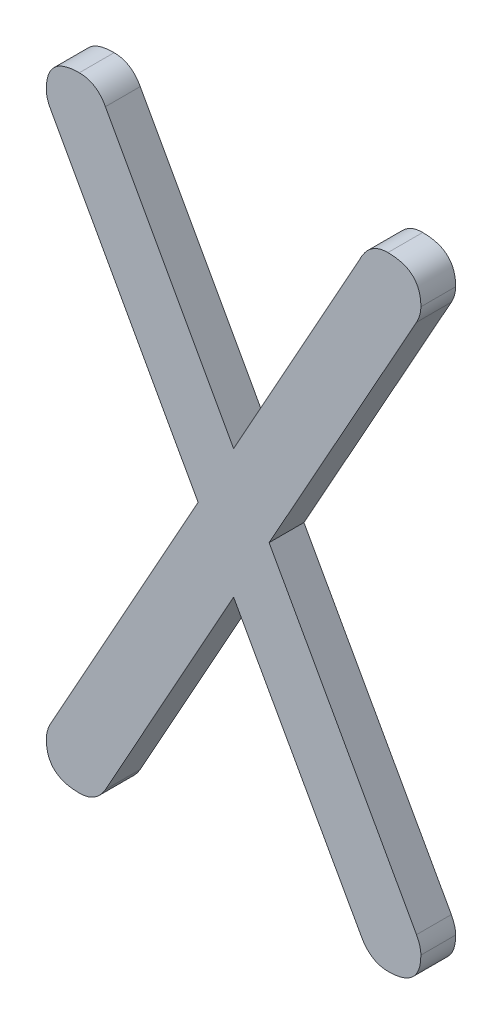
ISO-10303-21;
HEADER;
FILE_DESCRIPTION(('STEP AP214'),'2;1');
FILE_NAME('part.step','',(''),(''),'','','');
FILE_SCHEMA(('AUTOMOTIVE_DESIGN { 1 0 10303 214 1 1 1 1 }'));
ENDSEC;
DATA;
#1=APPLICATION_CONTEXT('core data for automotive mechanical design processes');
#2=APPLICATION_PROTOCOL_DEFINITION('international standard','automotive_design',2000,#1);
#3=PRODUCT_CONTEXT('',#1,'mechanical');
#4=PRODUCT('Part','Part','',(#3));
#5=PRODUCT_RELATED_PRODUCT_CATEGORY('part','',(#4));
#6=PRODUCT_DEFINITION_FORMATION('','',#4);
#7=PRODUCT_DEFINITION_CONTEXT('part definition',#1,'design');
#8=PRODUCT_DEFINITION('design','',#6,#7);
#9=PRODUCT_DEFINITION_SHAPE('','',#8);
#10=(LENGTH_UNIT() NAMED_UNIT(*) SI_UNIT(.MILLI.,.METRE.));
#11=(NAMED_UNIT(*) PLANE_ANGLE_UNIT() SI_UNIT($,.RADIAN.));
#12=(NAMED_UNIT(*) SI_UNIT($,.STERADIAN.) SOLID_ANGLE_UNIT());
#13=UNCERTAINTY_MEASURE_WITH_UNIT(LENGTH_MEASURE(1.E-05),#10,'distance_accuracy_value','');
#14=(GEOMETRIC_REPRESENTATION_CONTEXT(3) GLOBAL_UNCERTAINTY_ASSIGNED_CONTEXT((#13)) GLOBAL_UNIT_ASSIGNED_CONTEXT((#10,
#11,#12)) REPRESENTATION_CONTEXT('',''));
#15=CARTESIAN_POINT('',(0.,0.,0.));
#16=DIRECTION('',(0.,0.,1.));
#17=DIRECTION('',(1.,0.,0.));
#18=AXIS2_PLACEMENT_3D('',#15,#16,#17);
#19=CARTESIAN_POINT('',(0.,0.,1.7));
#20=DIRECTION('',(0.,0.,-1.));
#21=DIRECTION('',(-1.,0.,0.));
#22=AXIS2_PLACEMENT_3D('',#19,#20,#21);
#23=PLANE('',#22);
#24=CARTESIAN_POINT('',(-7.9830062525272,-20.3729297798276,1.7));
#25=CARTESIAN_POINT('',(-7.9830062525272,-20.3943672798276,1.7));
#26=CARTESIAN_POINT('',(-7.9955062525272,-20.4176172798276,1.7));
#27=B_SPLINE_CURVE_WITH_KNOTS('',2,(#24,#25,#26),.UNSPECIFIED.,.F.,.F.,(3,3),(0.,1.),.UNSPECIFIED.);
#28=CARTESIAN_POINT('',(-7.9955062525272,-20.4176172798276,1.7));
#29=VERTEX_POINT('',#28);
#30=CARTESIAN_POINT('',(-7.9830062525272,-20.3729297798276,1.7));
#31=VERTEX_POINT('',#30);
#32=EDGE_CURVE('E238',#29,#31,#27,.F.);
#33=ORIENTED_EDGE('',*,*,#32,.T.);
#34=CARTESIAN_POINT('',(-8.0776937525272,-20.2853047798276,1.7));
#35=CARTESIAN_POINT('',(-7.9830062525272,-20.2853047798276,1.7));
#36=CARTESIAN_POINT('',(-7.9830062525272,-20.3729297798276,1.7));
#37=B_SPLINE_CURVE_WITH_KNOTS('',2,(#34,#35,#36),.UNSPECIFIED.,.F.,.F.,(3,3),(0.,1.),.UNSPECIFIED.);
#38=CARTESIAN_POINT('',(-8.0776937525272,-20.2853047798276,1.7));
#39=VERTEX_POINT('',#38);
#40=EDGE_CURVE('E243',#31,#39,#37,.F.);
#41=ORIENTED_EDGE('',*,*,#40,.T.);
#42=CARTESIAN_POINT('',(-8.1526937525272,-20.3318047798276,1.7));
#43=CARTESIAN_POINT('',(-8.1259437525272,-20.2853047798276,1.7));
#44=CARTESIAN_POINT('',(-8.0776937525272,-20.2853047798276,1.7));
#45=B_SPLINE_CURVE_WITH_KNOTS('',2,(#42,#43,#44),.UNSPECIFIED.,.F.,.F.,(3,3),(0.,1.),.UNSPECIFIED.);
#46=CARTESIAN_POINT('',(-8.1526937525272,-20.3318047798276,1.7));
#47=VERTEX_POINT('',#46);
#48=EDGE_CURVE('E244',#39,#47,#45,.F.);
#49=ORIENTED_EDGE('',*,*,#48,.T.);
#50=DIRECTION('',(-0.485663926769932,-0.874145611574187,0.));
#51=VECTOR('',#50,1.);
#52=CARTESIAN_POINT('',(-8.5209437525272,-20.9946172798276,1.7));
#53=LINE('',#52,#51);
#54=CARTESIAN_POINT('',(-8.5209437525272,-20.9946172798276,1.7));
#55=VERTEX_POINT('',#54);
#56=EDGE_CURVE('E177',#55,#47,#53,.F.);
#57=ORIENTED_EDGE('',*,*,#56,.F.);
#58=DIRECTION('',(-0.483578544865711,0.875300971635221,0.));
#59=VECTOR('',#58,1.);
#60=CARTESIAN_POINT('',(-8.8891312525272,-20.3281797798276,1.7));
#61=LINE('',#60,#59);
#62=CARTESIAN_POINT('',(-8.8891312525272,-20.3281797798276,1.7));
#63=VERTEX_POINT('',#62);
#64=EDGE_CURVE('E173',#63,#55,#61,.F.);
#65=ORIENTED_EDGE('',*,*,#64,.F.);
#66=CARTESIAN_POINT('',(-8.9641937525272,-20.2813047798276,1.7));
#67=CARTESIAN_POINT('',(-8.9141312525272,-20.2813047798276,1.7));
#68=CARTESIAN_POINT('',(-8.8891312525272,-20.3281797798276,1.7));
#69=B_SPLINE_CURVE_WITH_KNOTS('',2,(#66,#67,#68),.UNSPECIFIED.,.F.,.F.,(3,3),(0.,1.),.UNSPECIFIED.);
#70=CARTESIAN_POINT('',(-8.9641937525272,-20.2813047798276,1.7));
#71=VERTEX_POINT('',#70);
#72=EDGE_CURVE('E252',#63,#71,#69,.F.);
#73=ORIENTED_EDGE('',*,*,#72,.T.);
#74=CARTESIAN_POINT('',(-9.0588812525272,-20.3689297798276,1.7));
#75=CARTESIAN_POINT('',(-9.0588812525272,-20.2813047798276,1.7));
#76=CARTESIAN_POINT('',(-8.9641937525272,-20.2813047798276,1.7));
#77=B_SPLINE_CURVE_WITH_KNOTS('',2,(#74,#75,#76),.UNSPECIFIED.,.F.,.F.,(3,3),(0.,1.),.UNSPECIFIED.);
#78=CARTESIAN_POINT('',(-9.0588812525272,-20.3689297798276,1.7));
#79=VERTEX_POINT('',#78);
#80=EDGE_CURVE('E255',#71,#79,#77,.F.);
#81=ORIENTED_EDGE('',*,*,#80,.T.);
#82=CARTESIAN_POINT('',(-9.0463812525272,-20.4136172798276,1.7));
#83=CARTESIAN_POINT('',(-9.0588812525272,-20.3921797798276,1.7));
#84=CARTESIAN_POINT('',(-9.0588812525272,-20.3689297798276,1.7));
#85=B_SPLINE_CURVE_WITH_KNOTS('',2,(#82,#83,#84),.UNSPECIFIED.,.F.,.F.,(3,3),(0.,1.),.UNSPECIFIED.);
#86=CARTESIAN_POINT('',(-9.0463812525272,-20.4136172798276,1.7));
#87=VERTEX_POINT('',#86);
#88=EDGE_CURVE('E258',#79,#87,#85,.F.);
#89=ORIENTED_EDGE('',*,*,#88,.T.);
#90=DIRECTION('',(0.484034615025409,-0.875048850897597,0.));
#91=VECTOR('',#90,1.);
#92=CARTESIAN_POINT('',(-8.6229437525272,-21.1791172798276,1.7));
#93=LINE('',#92,#91);
#94=CARTESIAN_POINT('',(-8.6229437525272,-21.1791172798276,1.7));
#95=VERTEX_POINT('',#94);
#96=EDGE_CURVE('E262',#95,#87,#93,.F.);
#97=ORIENTED_EDGE('',*,*,#96,.F.);
#98=DIRECTION('',(-0.485795125868977,-0.874072706176062,0.));
#99=VECTOR('',#98,1.);
#100=CARTESIAN_POINT('',(-9.0463812525272,-21.9409922798276,1.7));
#101=LINE('',#100,#99);
#102=CARTESIAN_POINT('',(-9.0463812525272,-21.9409922798276,1.7));
#103=VERTEX_POINT('',#102);
#104=EDGE_CURVE('E263',#103,#95,#101,.F.);
#105=ORIENTED_EDGE('',*,*,#104,.F.);
#106=CARTESIAN_POINT('',(-9.0588812525272,-21.9856797798276,1.7));
#107=CARTESIAN_POINT('',(-9.0588812525272,-21.9641797798276,1.7));
#108=CARTESIAN_POINT('',(-9.0463812525272,-21.9409922798276,1.7));
#109=B_SPLINE_CURVE_WITH_KNOTS('',2,(#106,#107,#108),.UNSPECIFIED.,.F.,.F.,(3,3),(0.,1.),.UNSPECIFIED.);
#110=CARTESIAN_POINT('',(-9.0588812525272,-21.9856797798276,1.7));
#111=VERTEX_POINT('',#110);
#112=EDGE_CURVE('E271',#103,#111,#109,.F.);
#113=ORIENTED_EDGE('',*,*,#112,.T.);
#114=CARTESIAN_POINT('',(-8.9641937525272,-22.0733047798276,1.7));
#115=CARTESIAN_POINT('',(-9.0588812525272,-22.0733047798276,1.7));
#116=CARTESIAN_POINT('',(-9.0588812525272,-21.9856797798276,1.7));
#117=B_SPLINE_CURVE_WITH_KNOTS('',2,(#114,#115,#116),.UNSPECIFIED.,.F.,.F.,(3,3),(0.,1.),.UNSPECIFIED.);
#118=CARTESIAN_POINT('',(-8.9641937525272,-22.0733047798276,1.7));
#119=VERTEX_POINT('',#118);
#120=EDGE_CURVE('E274',#111,#119,#117,.F.);
#121=ORIENTED_EDGE('',*,*,#120,.T.);
#122=CARTESIAN_POINT('',(-8.8891312525272,-22.0268672798276,1.7));
#123=CARTESIAN_POINT('',(-8.9159437525272,-22.0733047798276,1.7));
#124=CARTESIAN_POINT('',(-8.9641937525272,-22.0733047798276,1.7));
#125=B_SPLINE_CURVE_WITH_KNOTS('',2,(#122,#123,#124),.UNSPECIFIED.,.F.,.F.,(3,3),(0.,1.),.UNSPECIFIED.);
#126=CARTESIAN_POINT('',(-8.8891312525272,-22.0268672798276,1.7));
#127=VERTEX_POINT('',#126);
#128=EDGE_CURVE('E277',#119,#127,#125,.F.);
#129=ORIENTED_EDGE('',*,*,#128,.T.);
#130=DIRECTION('',(0.485565947412671,0.87420004044454,0.));
#131=VECTOR('',#130,1.);
#132=CARTESIAN_POINT('',(-8.5209437525272,-21.3639922798276,1.7));
#133=LINE('',#132,#131);
#134=CARTESIAN_POINT('',(-8.5209437525272,-21.3639922798276,1.7));
#135=VERTEX_POINT('',#134);
#136=EDGE_CURVE('E281',#135,#127,#133,.F.);
#137=ORIENTED_EDGE('',*,*,#136,.F.);
#138=DIRECTION('',(0.48562893497062,-0.874165051646027,0.));
#139=VECTOR('',#138,1.);
#140=CARTESIAN_POINT('',(-8.1526937525272,-22.0268672798276,1.7));
#141=LINE('',#140,#139);
#142=CARTESIAN_POINT('',(-8.1526937525272,-22.0268672798276,1.7));
#143=VERTEX_POINT('',#142);
#144=EDGE_CURVE('E282',#143,#135,#141,.F.);
#145=ORIENTED_EDGE('',*,*,#144,.F.);
#146=CARTESIAN_POINT('',(-8.0776937525272,-22.0733047798276,1.7));
#147=CARTESIAN_POINT('',(-8.1259437525272,-22.0733047798276,1.7));
#148=CARTESIAN_POINT('',(-8.1526937525272,-22.0268672798276,1.7));
#149=B_SPLINE_CURVE_WITH_KNOTS('',2,(#146,#147,#148),.UNSPECIFIED.,.F.,.F.,(3,3),(0.,1.),.UNSPECIFIED.);
#150=CARTESIAN_POINT('',(-8.0776937525272,-22.0733047798276,1.7));
#151=VERTEX_POINT('',#150);
#152=EDGE_CURVE('E290',#143,#151,#149,.F.);
#153=ORIENTED_EDGE('',*,*,#152,.T.);
#154=CARTESIAN_POINT('',(-7.9830062525272,-21.9856797798276,1.7));
#155=CARTESIAN_POINT('',(-7.9830062525272,-22.0733047798276,1.7));
#156=CARTESIAN_POINT('',(-8.0776937525272,-22.0733047798276,1.7));
#157=B_SPLINE_CURVE_WITH_KNOTS('',2,(#154,#155,#156),.UNSPECIFIED.,.F.,.F.,(3,3),(0.,1.),.UNSPECIFIED.);
#158=CARTESIAN_POINT('',(-7.9830062525272,-21.9856797798276,1.7));
#159=VERTEX_POINT('',#158);
#160=EDGE_CURVE('E138',#151,#159,#157,.F.);
#161=ORIENTED_EDGE('',*,*,#160,.T.);
#162=CARTESIAN_POINT('',(-7.9955062525272,-21.9409922798276,1.7));
#163=CARTESIAN_POINT('',(-7.9830062525272,-21.9642422798276,1.7));
#164=CARTESIAN_POINT('',(-7.9830062525272,-21.9856797798276,1.7));
#165=B_SPLINE_CURVE_WITH_KNOTS('',2,(#162,#163,#164),.UNSPECIFIED.,.F.,.F.,(3,3),(0.,1.),.UNSPECIFIED.);
#166=CARTESIAN_POINT('',(-7.9955062525272,-21.9409922798276,1.7));
#167=VERTEX_POINT('',#166);
#168=EDGE_CURVE('E142',#159,#167,#165,.F.);
#169=ORIENTED_EDGE('',*,*,#168,.T.);
#170=DIRECTION('',(-0.485004593379462,0.874511603354022,0.));
#171=VECTOR('',#170,1.);
#172=CARTESIAN_POINT('',(-8.4189437525272,-21.1774922798276,1.7));
#173=LINE('',#172,#171);
#174=CARTESIAN_POINT('',(-8.4189437525272,-21.1774922798276,1.7));
#175=VERTEX_POINT('',#174);
#176=EDGE_CURVE('E298',#175,#167,#173,.F.);
#177=ORIENTED_EDGE('',*,*,#176,.F.);
#178=DIRECTION('',(0.486771084356984,0.873529571012868,0.));
#179=VECTOR('',#178,1.);
#180=CARTESIAN_POINT('',(-7.9955062525272,-20.4176172798276,1.7));
#181=LINE('',#180,#179);
#182=EDGE_CURVE('E148',#29,#175,#181,.F.);
#183=ORIENTED_EDGE('',*,*,#182,.F.);
#184=EDGE_LOOP('',(#33,#41,#49,#57,#65,#73,#81,#89,#97,#105,#113,#121,#129,#137,#145,#153,#161,
#169,#177,#183));
#185=FACE_BOUND('',#184,.T.);
#186=ADVANCED_FACE('F17',(#185),#23,.F.);
#187=CARTESIAN_POINT('',(-7.9955062525272,-20.4176172798276,1.7));
#188=DIRECTION('',(0.873529571012868,-0.486771084356984,0.));
#189=DIRECTION('',(0.486771084356984,0.873529571012868,0.));
#190=AXIS2_PLACEMENT_3D('',#187,#188,#189);
#191=PLANE('',#190);
#192=ORIENTED_EDGE('',*,*,#182,.T.);
#193=DIRECTION('',(0.,0.,1.));
#194=VECTOR('',#193,1.);
#195=CARTESIAN_POINT('',(-8.4189437525272,-21.1774922798276,1.7));
#196=LINE('',#195,#194);
#197=CARTESIAN_POINT('',(-8.4189437525272,-21.1774922798276,1.6));
#198=VERTEX_POINT('',#197);
#199=EDGE_CURVE('E295',#198,#175,#196,.T.);
#200=ORIENTED_EDGE('',*,*,#199,.F.);
#201=DIRECTION('',(-0.486771084356982,-0.87352957101287,0.));
#202=VECTOR('',#201,1.);
#203=CARTESIAN_POINT('',(-7.9955062525272,-20.4176172798276,1.6));
#204=LINE('',#203,#202);
#205=CARTESIAN_POINT('',(-7.9955062525272,-20.4176172798276,1.6));
#206=VERTEX_POINT('',#205);
#207=EDGE_CURVE('E230',#206,#198,#204,.T.);
#208=ORIENTED_EDGE('',*,*,#207,.F.);
#209=DIRECTION('',(0.,0.,1.));
#210=VECTOR('',#209,1.);
#211=CARTESIAN_POINT('',(-7.9955062525272,-20.4176172798276,1.65));
#212=LINE('',#211,#210);
#213=EDGE_CURVE('E239',#206,#29,#212,.T.);
#214=ORIENTED_EDGE('',*,*,#213,.T.);
#215=EDGE_LOOP('',(#192,#200,#208,#214));
#216=FACE_BOUND('',#215,.T.);
#217=ADVANCED_FACE('F315',(#216),#191,.T.);
#218=CARTESIAN_POINT('',(-8.4189437525272,-21.1774922798276,1.7));
#219=DIRECTION('',(0.874511603354022,0.485004593379462,0.));
#220=DIRECTION('',(-0.485004593379462,0.874511603354022,0.));
#221=AXIS2_PLACEMENT_3D('',#218,#219,#220);
#222=PLANE('',#221);
#223=ORIENTED_EDGE('',*,*,#176,.T.);
#224=DIRECTION('',(0.,0.,-1.));
#225=VECTOR('',#224,1.);
#226=CARTESIAN_POINT('',(-7.9955062525272,-21.9409922798276,1.65));
#227=LINE('',#226,#225);
#228=CARTESIAN_POINT('',(-7.9955062525272,-21.9409922798276,1.6));
#229=VERTEX_POINT('',#228);
#230=EDGE_CURVE('E293',#167,#229,#227,.T.);
#231=ORIENTED_EDGE('',*,*,#230,.T.);
#232=DIRECTION('',(0.485004593379462,-0.874511603354023,0.));
#233=VECTOR('',#232,1.);
#234=CARTESIAN_POINT('',(-8.4189437525272,-21.1774922798276,1.6));
#235=LINE('',#234,#233);
#236=EDGE_CURVE('E226',#198,#229,#235,.T.);
#237=ORIENTED_EDGE('',*,*,#236,.F.);
#238=ORIENTED_EDGE('',*,*,#199,.T.);
#239=EDGE_LOOP('',(#223,#231,#237,#238));
#240=FACE_BOUND('',#239,.T.);
#241=ADVANCED_FACE('F455',(#240),#222,.T.);
#242=CARTESIAN_POINT('',(-7.9955062525272,-21.9409922798276,1.7));
#243=CARTESIAN_POINT('',(-7.9830062525272,-21.9642422798276,1.7));
#244=CARTESIAN_POINT('',(-7.9830062525272,-21.9856797798276,1.7));
#245=CARTESIAN_POINT('',(-7.9955062525272,-21.9409922798276,1.6));
#246=CARTESIAN_POINT('',(-7.9830062525272,-21.9642422798276,1.6));
#247=CARTESIAN_POINT('',(-7.9830062525272,-21.9856797798276,1.6));
#248=B_SPLINE_SURFACE_WITH_KNOTS('',1,2,((#242,#243,#244),(#245,#246,#247)),.UNSPECIFIED.,.F.,
.F.,.F.,(2,2),(3,3),(0.,1.),(0.,1.),.UNSPECIFIED.);
#249=DIRECTION('',(0.,0.,-1.));
#250=VECTOR('',#249,1.);
#251=CARTESIAN_POINT('',(-7.9830062525272,-21.9856797798276,1.65));
#252=LINE('',#251,#250);
#253=CARTESIAN_POINT('',(-7.9830062525272,-21.9856797798276,1.6));
#254=VERTEX_POINT('',#253);
#255=EDGE_CURVE('E291',#159,#254,#252,.T.);
#256=CARTESIAN_POINT('',(-7.9955062525272,-21.9409922798276,1.6));
#257=CARTESIAN_POINT('',(-7.9830062525272,-21.9642422798276,1.6));
#258=CARTESIAN_POINT('',(-7.9830062525272,-21.9856797798276,1.6));
#259=B_SPLINE_CURVE_WITH_KNOTS('',2,(#256,#257,#258),.UNSPECIFIED.,.F.,.F.,(3,3),(0.,1.),.UNSPECIFIED.);
#260=EDGE_CURVE('E229',#229,#254,#259,.T.);
#261=ORIENTED_EDGE('',*,*,#230,.F.);
#262=ORIENTED_EDGE('',*,*,#168,.F.);
#263=ORIENTED_EDGE('',*,*,#255,.T.);
#264=ORIENTED_EDGE('',*,*,#260,.F.);
#265=EDGE_LOOP('',(#261,#262,#263,#264));
#266=FACE_BOUND('',#265,.T.);
#267=ADVANCED_FACE('F317',(#266),#248,.F.);
#268=CARTESIAN_POINT('',(-7.9830062525272,-21.9856797798276,1.7));
#269=CARTESIAN_POINT('',(-7.9830062525272,-22.0733047798276,1.7));
#270=CARTESIAN_POINT('',(-8.0776937525272,-22.0733047798276,1.7));
#271=CARTESIAN_POINT('',(-7.9830062525272,-21.9856797798276,1.6));
#272=CARTESIAN_POINT('',(-7.9830062525272,-22.0733047798276,1.6));
#273=CARTESIAN_POINT('',(-8.0776937525272,-22.0733047798276,1.6));
#274=B_SPLINE_SURFACE_WITH_KNOTS('',1,2,((#268,#269,#270),(#271,#272,#273)),.UNSPECIFIED.,.F.,
.F.,.F.,(2,2),(3,3),(0.,1.),(0.,1.),.UNSPECIFIED.);
#275=DIRECTION('',(0.,0.,-1.));
#276=VECTOR('',#275,1.);
#277=CARTESIAN_POINT('',(-8.0776937525272,-22.0733047798276,1.65));
#278=LINE('',#277,#276);
#279=CARTESIAN_POINT('',(-8.0776937525272,-22.0733047798276,1.6));
#280=VERTEX_POINT('',#279);
#281=EDGE_CURVE('E288',#151,#280,#278,.T.);
#282=CARTESIAN_POINT('',(-7.9830062525272,-21.9856797798276,1.6));
#283=CARTESIAN_POINT('',(-7.9830062525272,-22.0733047798276,1.6));
#284=CARTESIAN_POINT('',(-8.0776937525272,-22.0733047798276,1.6));
#285=B_SPLINE_CURVE_WITH_KNOTS('',2,(#282,#283,#284),.UNSPECIFIED.,.F.,.F.,(3,3),(0.,1.),.UNSPECIFIED.);
#286=EDGE_CURVE('E393',#254,#280,#285,.T.);
#287=ORIENTED_EDGE('',*,*,#255,.F.);
#288=ORIENTED_EDGE('',*,*,#160,.F.);
#289=ORIENTED_EDGE('',*,*,#281,.T.);
#290=ORIENTED_EDGE('',*,*,#286,.F.);
#291=EDGE_LOOP('',(#287,#288,#289,#290));
#292=FACE_BOUND('',#291,.T.);
#293=ADVANCED_FACE('F558',(#292),#274,.F.);
#294=CARTESIAN_POINT('',(-8.0776937525272,-22.0733047798276,1.7));
#295=CARTESIAN_POINT('',(-8.1259437525272,-22.0733047798276,1.7));
#296=CARTESIAN_POINT('',(-8.1526937525272,-22.0268672798276,1.7));
#297=CARTESIAN_POINT('',(-8.0776937525272,-22.0733047798276,1.6));
#298=CARTESIAN_POINT('',(-8.1259437525272,-22.0733047798276,1.6));
#299=CARTESIAN_POINT('',(-8.1526937525272,-22.0268672798276,1.6));
#300=B_SPLINE_SURFACE_WITH_KNOTS('',1,2,((#294,#295,#296),(#297,#298,#299)),.UNSPECIFIED.,.F.,
.F.,.F.,(2,2),(3,3),(0.,1.),(0.,1.),.UNSPECIFIED.);
#301=DIRECTION('',(0.,0.,1.));
#302=VECTOR('',#301,1.);
#303=CARTESIAN_POINT('',(-8.1526937525272,-22.0268672798276,1.7));
#304=LINE('',#303,#302);
#305=CARTESIAN_POINT('',(-8.1526937525272,-22.0268672798276,1.6));
#306=VERTEX_POINT('',#305);
#307=EDGE_CURVE('E285',#306,#143,#304,.T.);
#308=CARTESIAN_POINT('',(-8.0776937525272,-22.0733047798276,1.6));
#309=CARTESIAN_POINT('',(-8.1259437525272,-22.0733047798276,1.6));
#310=CARTESIAN_POINT('',(-8.1526937525272,-22.0268672798276,1.6));
#311=B_SPLINE_CURVE_WITH_KNOTS('',2,(#308,#309,#310),.UNSPECIFIED.,.F.,.F.,(3,3),(0.,1.),.UNSPECIFIED.);
#312=EDGE_CURVE('E223',#280,#306,#311,.T.);
#313=ORIENTED_EDGE('',*,*,#281,.F.);
#314=ORIENTED_EDGE('',*,*,#152,.F.);
#315=ORIENTED_EDGE('',*,*,#307,.F.);
#316=ORIENTED_EDGE('',*,*,#312,.F.);
#317=EDGE_LOOP('',(#313,#314,#315,#316));
#318=FACE_BOUND('',#317,.T.);
#319=ADVANCED_FACE('F548',(#318),#300,.F.);
#320=CARTESIAN_POINT('',(-8.1526937525272,-22.0268672798276,1.7));
#321=DIRECTION('',(-0.874165051646027,-0.48562893497062,0.));
#322=DIRECTION('',(0.48562893497062,-0.874165051646027,0.));
#323=AXIS2_PLACEMENT_3D('',#320,#321,#322);
#324=PLANE('',#323);
#325=ORIENTED_EDGE('',*,*,#144,.T.);
#326=DIRECTION('',(0.,0.,1.));
#327=VECTOR('',#326,1.);
#328=CARTESIAN_POINT('',(-8.5209437525272,-21.3639922798276,1.7));
#329=LINE('',#328,#327);
#330=CARTESIAN_POINT('',(-8.5209437525272,-21.3639922798276,1.6));
#331=VERTEX_POINT('',#330);
#332=EDGE_CURVE('E278',#331,#135,#329,.T.);
#333=ORIENTED_EDGE('',*,*,#332,.F.);
#334=DIRECTION('',(-0.48562893497062,0.874165051646027,0.));
#335=VECTOR('',#334,1.);
#336=CARTESIAN_POINT('',(-8.1526937525272,-22.0268672798276,1.6));
#337=LINE('',#336,#335);
#338=EDGE_CURVE('E218',#306,#331,#337,.T.);
#339=ORIENTED_EDGE('',*,*,#338,.F.);
#340=ORIENTED_EDGE('',*,*,#307,.T.);
#341=EDGE_LOOP('',(#325,#333,#339,#340));
#342=FACE_BOUND('',#341,.T.);
#343=ADVANCED_FACE('F557',(#342),#324,.T.);
#344=CARTESIAN_POINT('',(-8.5209437525272,-21.3639922798276,1.7));
#345=DIRECTION('',(0.87420004044454,-0.485565947412671,0.));
#346=DIRECTION('',(0.485565947412671,0.87420004044454,0.));
#347=AXIS2_PLACEMENT_3D('',#344,#345,#346);
#348=PLANE('',#347);
#349=ORIENTED_EDGE('',*,*,#136,.T.);
#350=DIRECTION('',(0.,0.,-1.));
#351=VECTOR('',#350,1.);
#352=CARTESIAN_POINT('',(-8.8891312525272,-22.0268672798276,1.65));
#353=LINE('',#352,#351);
#354=CARTESIAN_POINT('',(-8.8891312525272,-22.0268672798276,1.6));
#355=VERTEX_POINT('',#354);
#356=EDGE_CURVE('E275',#127,#355,#353,.T.);
#357=ORIENTED_EDGE('',*,*,#356,.T.);
#358=DIRECTION('',(-0.485565947412671,-0.87420004044454,0.));
#359=VECTOR('',#358,1.);
#360=CARTESIAN_POINT('',(-8.5209437525272,-21.3639922798276,1.6));
#361=LINE('',#360,#359);
#362=EDGE_CURVE('E214',#331,#355,#361,.T.);
#363=ORIENTED_EDGE('',*,*,#362,.F.);
#364=ORIENTED_EDGE('',*,*,#332,.T.);
#365=EDGE_LOOP('',(#349,#357,#363,#364));
#366=FACE_BOUND('',#365,.T.);
#367=ADVANCED_FACE('F546',(#366),#348,.T.);
#368=CARTESIAN_POINT('',(-8.8891312525272,-22.0268672798276,1.7));
#369=CARTESIAN_POINT('',(-8.9159437525272,-22.0733047798276,1.7));
#370=CARTESIAN_POINT('',(-8.9641937525272,-22.0733047798276,1.7));
#371=CARTESIAN_POINT('',(-8.8891312525272,-22.0268672798276,1.6));
#372=CARTESIAN_POINT('',(-8.9159437525272,-22.0733047798276,1.6));
#373=CARTESIAN_POINT('',(-8.9641937525272,-22.0733047798276,1.6));
#374=B_SPLINE_SURFACE_WITH_KNOTS('',1,2,((#368,#369,#370),(#371,#372,#373)),.UNSPECIFIED.,.F.,
.F.,.F.,(2,2),(3,3),(0.,1.),(0.,1.),.UNSPECIFIED.);
#375=DIRECTION('',(0.,0.,-1.));
#376=VECTOR('',#375,1.);
#377=CARTESIAN_POINT('',(-8.9641937525272,-22.0733047798276,1.65));
#378=LINE('',#377,#376);
#379=CARTESIAN_POINT('',(-8.9641937525272,-22.0733047798276,1.6));
#380=VERTEX_POINT('',#379);
#381=EDGE_CURVE('E272',#119,#380,#378,.T.);
#382=CARTESIAN_POINT('',(-8.8891312525272,-22.0268672798276,1.6));
#383=CARTESIAN_POINT('',(-8.9159437525272,-22.0733047798276,1.6));
#384=CARTESIAN_POINT('',(-8.9641937525272,-22.0733047798276,1.6));
#385=B_SPLINE_CURVE_WITH_KNOTS('',2,(#382,#383,#384),.UNSPECIFIED.,.F.,.F.,(3,3),(0.,1.),.UNSPECIFIED.);
#386=EDGE_CURVE('E217',#355,#380,#385,.T.);
#387=ORIENTED_EDGE('',*,*,#356,.F.);
#388=ORIENTED_EDGE('',*,*,#128,.F.);
#389=ORIENTED_EDGE('',*,*,#381,.T.);
#390=ORIENTED_EDGE('',*,*,#386,.F.);
#391=EDGE_LOOP('',(#387,#388,#389,#390));
#392=FACE_BOUND('',#391,.T.);
#393=ADVANCED_FACE('F535',(#392),#374,.F.);
#394=CARTESIAN_POINT('',(-8.9641937525272,-22.0733047798276,1.7));
#395=CARTESIAN_POINT('',(-9.0588812525272,-22.0733047798276,1.7));
#396=CARTESIAN_POINT('',(-9.0588812525272,-21.9856797798276,1.7));
#397=CARTESIAN_POINT('',(-8.9641937525272,-22.0733047798276,1.6));
#398=CARTESIAN_POINT('',(-9.0588812525272,-22.0733047798276,1.6));
#399=CARTESIAN_POINT('',(-9.0588812525272,-21.9856797798276,1.6));
#400=B_SPLINE_SURFACE_WITH_KNOTS('',1,2,((#394,#395,#396),(#397,#398,#399)),.UNSPECIFIED.,.F.,
.F.,.F.,(2,2),(3,3),(0.,1.),(0.,1.),.UNSPECIFIED.);
#401=DIRECTION('',(0.,0.,-1.));
#402=VECTOR('',#401,1.);
#403=CARTESIAN_POINT('',(-9.0588812525272,-21.9856797798276,1.65));
#404=LINE('',#403,#402);
#405=CARTESIAN_POINT('',(-9.0588812525272,-21.9856797798276,1.6));
#406=VERTEX_POINT('',#405);
#407=EDGE_CURVE('E269',#111,#406,#404,.T.);
#408=CARTESIAN_POINT('',(-8.9641937525272,-22.0733047798276,1.6));
#409=CARTESIAN_POINT('',(-9.0588812525272,-22.0733047798276,1.6));
#410=CARTESIAN_POINT('',(-9.0588812525272,-21.9856797798276,1.6));
#411=B_SPLINE_CURVE_WITH_KNOTS('',2,(#408,#409,#410),.UNSPECIFIED.,.F.,.F.,(3,3),(0.,1.),.UNSPECIFIED.);
#412=EDGE_CURVE('E403',#380,#406,#411,.T.);
#413=ORIENTED_EDGE('',*,*,#381,.F.);
#414=ORIENTED_EDGE('',*,*,#120,.F.);
#415=ORIENTED_EDGE('',*,*,#407,.T.);
#416=ORIENTED_EDGE('',*,*,#412,.F.);
#417=EDGE_LOOP('',(#413,#414,#415,#416));
#418=FACE_BOUND('',#417,.T.);
#419=ADVANCED_FACE('F524',(#418),#400,.F.);
#420=CARTESIAN_POINT('',(-9.0588812525272,-21.9856797798276,1.7));
#421=CARTESIAN_POINT('',(-9.0588812525272,-21.9641797798276,1.7));
#422=CARTESIAN_POINT('',(-9.0463812525272,-21.9409922798276,1.7));
#423=CARTESIAN_POINT('',(-9.0588812525272,-21.9856797798276,1.6));
#424=CARTESIAN_POINT('',(-9.0588812525272,-21.9641797798276,1.6));
#425=CARTESIAN_POINT('',(-9.0463812525272,-21.9409922798276,1.6));
#426=B_SPLINE_SURFACE_WITH_KNOTS('',1,2,((#420,#421,#422),(#423,#424,#425)),.UNSPECIFIED.,.F.,
.F.,.F.,(2,2),(3,3),(0.,1.),(0.,1.),.UNSPECIFIED.);
#427=DIRECTION('',(0.,0.,1.));
#428=VECTOR('',#427,1.);
#429=CARTESIAN_POINT('',(-9.0463812525272,-21.9409922798276,1.7));
#430=LINE('',#429,#428);
#431=CARTESIAN_POINT('',(-9.0463812525272,-21.9409922798276,1.6));
#432=VERTEX_POINT('',#431);
#433=EDGE_CURVE('E266',#432,#103,#430,.T.);
#434=CARTESIAN_POINT('',(-9.0588812525272,-21.9856797798276,1.6));
#435=CARTESIAN_POINT('',(-9.0588812525272,-21.9641797798276,1.6));
#436=CARTESIAN_POINT('',(-9.0463812525272,-21.9409922798276,1.6));
#437=B_SPLINE_CURVE_WITH_KNOTS('',2,(#434,#435,#436),.UNSPECIFIED.,.F.,.F.,(3,3),(0.,1.),.UNSPECIFIED.);
#438=EDGE_CURVE('E211',#406,#432,#437,.T.);
#439=ORIENTED_EDGE('',*,*,#407,.F.);
#440=ORIENTED_EDGE('',*,*,#112,.F.);
#441=ORIENTED_EDGE('',*,*,#433,.F.);
#442=ORIENTED_EDGE('',*,*,#438,.F.);
#443=EDGE_LOOP('',(#439,#440,#441,#442));
#444=FACE_BOUND('',#443,.T.);
#445=ADVANCED_FACE('F513',(#444),#426,.F.);
#446=CARTESIAN_POINT('',(-9.0463812525272,-21.9409922798276,1.7));
#447=DIRECTION('',(-0.874072706176062,0.485795125868977,0.));
#448=DIRECTION('',(-0.485795125868977,-0.874072706176062,0.));
#449=AXIS2_PLACEMENT_3D('',#446,#447,#448);
#450=PLANE('',#449);
#451=ORIENTED_EDGE('',*,*,#104,.T.);
#452=DIRECTION('',(0.,0.,1.));
#453=VECTOR('',#452,1.);
#454=CARTESIAN_POINT('',(-8.6229437525272,-21.1791172798276,1.7));
#455=LINE('',#454,#453);
#456=CARTESIAN_POINT('',(-8.6229437525272,-21.1791172798276,1.6));
#457=VERTEX_POINT('',#456);
#458=EDGE_CURVE('E259',#457,#95,#455,.T.);
#459=ORIENTED_EDGE('',*,*,#458,.F.);
#460=DIRECTION('',(0.485795125868976,0.874072706176063,0.));
#461=VECTOR('',#460,1.);
#462=CARTESIAN_POINT('',(-9.0463812525272,-21.9409922798276,1.6));
#463=LINE('',#462,#461);
#464=EDGE_CURVE('E206',#432,#457,#463,.T.);
#465=ORIENTED_EDGE('',*,*,#464,.F.);
#466=ORIENTED_EDGE('',*,*,#433,.T.);
#467=EDGE_LOOP('',(#451,#459,#465,#466));
#468=FACE_BOUND('',#467,.T.);
#469=ADVANCED_FACE('F523',(#468),#450,.T.);
#470=CARTESIAN_POINT('',(-8.6229437525272,-21.1791172798276,1.7));
#471=DIRECTION('',(-0.875048850897597,-0.484034615025409,0.));
#472=DIRECTION('',(0.484034615025409,-0.875048850897597,0.));
#473=AXIS2_PLACEMENT_3D('',#470,#471,#472);
#474=PLANE('',#473);
#475=ORIENTED_EDGE('',*,*,#96,.T.);
#476=DIRECTION('',(0.,0.,-1.));
#477=VECTOR('',#476,1.);
#478=CARTESIAN_POINT('',(-9.0463812525272,-20.4136172798276,1.65));
#479=LINE('',#478,#477);
#480=CARTESIAN_POINT('',(-9.0463812525272,-20.4136172798276,1.6));
#481=VERTEX_POINT('',#480);
#482=EDGE_CURVE('E256',#87,#481,#479,.T.);
#483=ORIENTED_EDGE('',*,*,#482,.T.);
#484=DIRECTION('',(-0.48403461502541,0.875048850897596,0.));
#485=VECTOR('',#484,1.);
#486=CARTESIAN_POINT('',(-8.6229437525272,-21.1791172798276,1.6));
#487=LINE('',#486,#485);
#488=EDGE_CURVE('E202',#457,#481,#487,.T.);
#489=ORIENTED_EDGE('',*,*,#488,.F.);
#490=ORIENTED_EDGE('',*,*,#458,.T.);
#491=EDGE_LOOP('',(#475,#483,#489,#490));
#492=FACE_BOUND('',#491,.T.);
#493=ADVANCED_FACE('F512',(#492),#474,.T.);
#494=CARTESIAN_POINT('',(-9.0463812525272,-20.4136172798276,1.7));
#495=CARTESIAN_POINT('',(-9.0588812525272,-20.3921797798276,1.7));
#496=CARTESIAN_POINT('',(-9.0588812525272,-20.3689297798276,1.7));
#497=CARTESIAN_POINT('',(-9.0463812525272,-20.4136172798276,1.6));
#498=CARTESIAN_POINT('',(-9.0588812525272,-20.3921797798276,1.6));
#499=CARTESIAN_POINT('',(-9.0588812525272,-20.3689297798276,1.6));
#500=B_SPLINE_SURFACE_WITH_KNOTS('',1,2,((#494,#495,#496),(#497,#498,#499)),.UNSPECIFIED.,.F.,
.F.,.F.,(2,2),(3,3),(0.,1.),(0.,1.),.UNSPECIFIED.);
#501=DIRECTION('',(0.,0.,-1.));
#502=VECTOR('',#501,1.);
#503=CARTESIAN_POINT('',(-9.0588812525272,-20.3689297798276,1.65));
#504=LINE('',#503,#502);
#505=CARTESIAN_POINT('',(-9.0588812525272,-20.3689297798276,1.6));
#506=VERTEX_POINT('',#505);
#507=EDGE_CURVE('E253',#79,#506,#504,.T.);
#508=CARTESIAN_POINT('',(-9.0463812525272,-20.4136172798276,1.6));
#509=CARTESIAN_POINT('',(-9.0588812525272,-20.3921797798276,1.6));
#510=CARTESIAN_POINT('',(-9.0588812525272,-20.3689297798276,1.6));
#511=B_SPLINE_CURVE_WITH_KNOTS('',2,(#508,#509,#510),.UNSPECIFIED.,.F.,.F.,(3,3),(0.,1.),.UNSPECIFIED.);
#512=EDGE_CURVE('E205',#481,#506,#511,.T.);
#513=ORIENTED_EDGE('',*,*,#482,.F.);
#514=ORIENTED_EDGE('',*,*,#88,.F.);
#515=ORIENTED_EDGE('',*,*,#507,.T.);
#516=ORIENTED_EDGE('',*,*,#512,.F.);
#517=EDGE_LOOP('',(#513,#514,#515,#516));
#518=FACE_BOUND('',#517,.T.);
#519=ADVANCED_FACE('F424',(#518),#500,.F.);
#520=CARTESIAN_POINT('',(-9.0588812525272,-20.3689297798276,1.7));
#521=CARTESIAN_POINT('',(-9.0588812525272,-20.2813047798276,1.7));
#522=CARTESIAN_POINT('',(-8.9641937525272,-20.2813047798276,1.7));
#523=CARTESIAN_POINT('',(-9.0588812525272,-20.3689297798276,1.6));
#524=CARTESIAN_POINT('',(-9.0588812525272,-20.2813047798276,1.6));
#525=CARTESIAN_POINT('',(-8.9641937525272,-20.2813047798276,1.6));
#526=B_SPLINE_SURFACE_WITH_KNOTS('',1,2,((#520,#521,#522),(#523,#524,#525)),.UNSPECIFIED.,.F.,
.F.,.F.,(2,2),(3,3),(0.,1.),(0.,1.),.UNSPECIFIED.);
#527=DIRECTION('',(0.,0.,-1.));
#528=VECTOR('',#527,1.);
#529=CARTESIAN_POINT('',(-8.9641937525272,-20.2813047798276,1.65));
#530=LINE('',#529,#528);
#531=CARTESIAN_POINT('',(-8.9641937525272,-20.2813047798276,1.6));
#532=VERTEX_POINT('',#531);
#533=EDGE_CURVE('E250',#71,#532,#530,.T.);
#534=CARTESIAN_POINT('',(-9.0588812525272,-20.3689297798276,1.6));
#535=CARTESIAN_POINT('',(-9.0588812525272,-20.2813047798276,1.6));
#536=CARTESIAN_POINT('',(-8.9641937525272,-20.2813047798276,1.6));
#537=B_SPLINE_CURVE_WITH_KNOTS('',2,(#534,#535,#536),.UNSPECIFIED.,.F.,.F.,(3,3),(0.,1.),.UNSPECIFIED.);
#538=EDGE_CURVE('E195',#506,#532,#537,.T.);
#539=ORIENTED_EDGE('',*,*,#507,.F.);
#540=ORIENTED_EDGE('',*,*,#80,.F.);
#541=ORIENTED_EDGE('',*,*,#533,.T.);
#542=ORIENTED_EDGE('',*,*,#538,.F.);
#543=EDGE_LOOP('',(#539,#540,#541,#542));
#544=FACE_BOUND('',#543,.T.);
#545=ADVANCED_FACE('F429',(#544),#526,.F.);
#546=CARTESIAN_POINT('',(-8.9641937525272,-20.2813047798276,1.7));
#547=CARTESIAN_POINT('',(-8.9141312525272,-20.2813047798276,1.7));
#548=CARTESIAN_POINT('',(-8.8891312525272,-20.3281797798276,1.7));
#549=CARTESIAN_POINT('',(-8.9641937525272,-20.2813047798276,1.6));
#550=CARTESIAN_POINT('',(-8.9141312525272,-20.2813047798276,1.6));
#551=CARTESIAN_POINT('',(-8.8891312525272,-20.3281797798276,1.6));
#552=B_SPLINE_SURFACE_WITH_KNOTS('',1,2,((#546,#547,#548),(#549,#550,#551)),.UNSPECIFIED.,.F.,
.F.,.F.,(2,2),(3,3),(0.,1.),(0.,1.),.UNSPECIFIED.);
#553=DIRECTION('',(0.,0.,1.));
#554=VECTOR('',#553,1.);
#555=CARTESIAN_POINT('',(-8.8891312525272,-20.3281797798276,1.7));
#556=LINE('',#555,#554);
#557=CARTESIAN_POINT('',(-8.8891312525272,-20.3281797798276,1.6));
#558=VERTEX_POINT('',#557);
#559=EDGE_CURVE('E248',#558,#63,#556,.T.);
#560=CARTESIAN_POINT('',(-8.9641937525272,-20.2813047798276,1.6));
#561=CARTESIAN_POINT('',(-8.9141312525272,-20.2813047798276,1.6));
#562=CARTESIAN_POINT('',(-8.8891312525272,-20.3281797798276,1.6));
#563=B_SPLINE_CURVE_WITH_KNOTS('',2,(#560,#561,#562),.UNSPECIFIED.,.F.,.F.,(3,3),(0.,1.),.UNSPECIFIED.);
#564=EDGE_CURVE('E193',#532,#558,#563,.T.);
#565=ORIENTED_EDGE('',*,*,#533,.F.);
#566=ORIENTED_EDGE('',*,*,#72,.F.);
#567=ORIENTED_EDGE('',*,*,#559,.F.);
#568=ORIENTED_EDGE('',*,*,#564,.F.);
#569=EDGE_LOOP('',(#565,#566,#567,#568));
#570=FACE_BOUND('',#569,.T.);
#571=ADVANCED_FACE('F432',(#570),#552,.F.);
#572=CARTESIAN_POINT('',(-8.8891312525272,-20.3281797798276,1.7));
#573=DIRECTION('',(0.875300971635221,0.483578544865711,0.));
#574=DIRECTION('',(-0.483578544865711,0.875300971635221,0.));
#575=AXIS2_PLACEMENT_3D('',#572,#573,#574);
#576=PLANE('',#575);
#577=ORIENTED_EDGE('',*,*,#64,.T.);
#578=DIRECTION('',(0.,0.,1.));
#579=VECTOR('',#578,1.);
#580=CARTESIAN_POINT('',(-8.5209437525272,-20.9946172798276,1.7));
#581=LINE('',#580,#579);
#582=CARTESIAN_POINT('',(-8.5209437525272,-20.9946172798276,1.6));
#583=VERTEX_POINT('',#582);
#584=EDGE_CURVE('E165',#583,#55,#581,.T.);
#585=ORIENTED_EDGE('',*,*,#584,.F.);
#586=DIRECTION('',(0.483578544865713,-0.87530097163522,0.));
#587=VECTOR('',#586,1.);
#588=CARTESIAN_POINT('',(-8.8891312525272,-20.3281797798276,1.6));
#589=LINE('',#588,#587);
#590=EDGE_CURVE('E170',#558,#583,#589,.T.);
#591=ORIENTED_EDGE('',*,*,#590,.F.);
#592=ORIENTED_EDGE('',*,*,#559,.T.);
#593=EDGE_LOOP('',(#577,#585,#591,#592));
#594=FACE_BOUND('',#593,.T.);
#595=ADVANCED_FACE('F167',(#594),#576,.T.);
#596=CARTESIAN_POINT('',(-8.5209437525272,-20.9946172798276,1.7));
#597=DIRECTION('',(-0.874145611574187,0.485663926769932,0.));
#598=DIRECTION('',(-0.485663926769932,-0.874145611574187,0.));
#599=AXIS2_PLACEMENT_3D('',#596,#597,#598);
#600=PLANE('',#599);
#601=ORIENTED_EDGE('',*,*,#56,.T.);
#602=DIRECTION('',(0.,0.,-1.));
#603=VECTOR('',#602,1.);
#604=CARTESIAN_POINT('',(-8.1526937525272,-20.3318047798276,1.65));
#605=LINE('',#604,#603);
#606=CARTESIAN_POINT('',(-8.1526937525272,-20.3318047798276,1.6));
#607=VERTEX_POINT('',#606);
#608=EDGE_CURVE('E183',#47,#607,#605,.T.);
#609=ORIENTED_EDGE('',*,*,#608,.T.);
#610=DIRECTION('',(0.485663926769932,0.874145611574187,0.));
#611=VECTOR('',#610,1.);
#612=CARTESIAN_POINT('',(-8.5209437525272,-20.9946172798276,1.6));
#613=LINE('',#612,#611);
#614=EDGE_CURVE('E180',#583,#607,#613,.T.);
#615=ORIENTED_EDGE('',*,*,#614,.F.);
#616=ORIENTED_EDGE('',*,*,#584,.T.);
#617=EDGE_LOOP('',(#601,#609,#615,#616));
#618=FACE_BOUND('',#617,.T.);
#619=ADVANCED_FACE('F181',(#618),#600,.T.);
#620=CARTESIAN_POINT('',(-8.1526937525272,-20.3318047798276,1.7));
#621=CARTESIAN_POINT('',(-8.1259437525272,-20.2853047798276,1.7));
#622=CARTESIAN_POINT('',(-8.0776937525272,-20.2853047798276,1.7));
#623=CARTESIAN_POINT('',(-8.1526937525272,-20.3318047798276,1.6));
#624=CARTESIAN_POINT('',(-8.1259437525272,-20.2853047798276,1.6));
#625=CARTESIAN_POINT('',(-8.0776937525272,-20.2853047798276,1.6));
#626=B_SPLINE_SURFACE_WITH_KNOTS('',1,2,((#620,#621,#622),(#623,#624,#625)),.UNSPECIFIED.,.F.,
.F.,.F.,(2,2),(3,3),(0.,1.),(0.,1.),.UNSPECIFIED.);
#627=DIRECTION('',(0.,0.,-1.));
#628=VECTOR('',#627,1.);
#629=CARTESIAN_POINT('',(-8.0776937525272,-20.2853047798276,1.65));
#630=LINE('',#629,#628);
#631=CARTESIAN_POINT('',(-8.0776937525272,-20.2853047798276,1.6));
#632=VERTEX_POINT('',#631);
#633=EDGE_CURVE('E241',#39,#632,#630,.T.);
#634=CARTESIAN_POINT('',(-8.1526937525272,-20.3318047798276,1.6));
#635=CARTESIAN_POINT('',(-8.1259437525272,-20.2853047798276,1.6));
#636=CARTESIAN_POINT('',(-8.0776937525272,-20.2853047798276,1.6));
#637=B_SPLINE_CURVE_WITH_KNOTS('',2,(#634,#635,#636),.UNSPECIFIED.,.F.,.F.,(3,3),(0.,1.),.UNSPECIFIED.);
#638=EDGE_CURVE('E187',#607,#632,#637,.T.);
#639=ORIENTED_EDGE('',*,*,#608,.F.);
#640=ORIENTED_EDGE('',*,*,#48,.F.);
#641=ORIENTED_EDGE('',*,*,#633,.T.);
#642=ORIENTED_EDGE('',*,*,#638,.F.);
#643=EDGE_LOOP('',(#639,#640,#641,#642));
#644=FACE_BOUND('',#643,.T.);
#645=ADVANCED_FACE('F366',(#644),#626,.F.);
#646=CARTESIAN_POINT('',(-8.0776937525272,-20.2853047798276,1.7));
#647=CARTESIAN_POINT('',(-7.9830062525272,-20.2853047798276,1.7));
#648=CARTESIAN_POINT('',(-7.9830062525272,-20.3729297798276,1.7));
#649=CARTESIAN_POINT('',(-8.0776937525272,-20.2853047798276,1.6));
#650=CARTESIAN_POINT('',(-7.9830062525272,-20.2853047798276,1.6));
#651=CARTESIAN_POINT('',(-7.9830062525272,-20.3729297798276,1.6));
#652=B_SPLINE_SURFACE_WITH_KNOTS('',1,2,((#646,#647,#648),(#649,#650,#651)),.UNSPECIFIED.,.F.,
.F.,.F.,(2,2),(3,3),(0.,1.),(0.,1.),.UNSPECIFIED.);
#653=DIRECTION('',(0.,0.,-1.));
#654=VECTOR('',#653,1.);
#655=CARTESIAN_POINT('',(-7.9830062525272,-20.3729297798276,1.65));
#656=LINE('',#655,#654);
#657=CARTESIAN_POINT('',(-7.9830062525272,-20.3729297798276,1.6));
#658=VERTEX_POINT('',#657);
#659=EDGE_CURVE('E38',#31,#658,#656,.T.);
#660=CARTESIAN_POINT('',(-8.0776937525272,-20.2853047798276,1.6));
#661=CARTESIAN_POINT('',(-7.9830062525272,-20.2853047798276,1.6));
#662=CARTESIAN_POINT('',(-7.9830062525272,-20.3729297798276,1.6));
#663=B_SPLINE_CURVE_WITH_KNOTS('',2,(#660,#661,#662),.UNSPECIFIED.,.F.,.F.,(3,3),(0.,1.),.UNSPECIFIED.);
#664=EDGE_CURVE('E29',#632,#658,#663,.T.);
#665=ORIENTED_EDGE('',*,*,#633,.F.);
#666=ORIENTED_EDGE('',*,*,#40,.F.);
#667=ORIENTED_EDGE('',*,*,#659,.T.);
#668=ORIENTED_EDGE('',*,*,#664,.F.);
#669=EDGE_LOOP('',(#665,#666,#667,#668));
#670=FACE_BOUND('',#669,.T.);
#671=ADVANCED_FACE('F367',(#670),#652,.F.);
#672=CARTESIAN_POINT('',(-7.9830062525272,-20.3729297798276,1.7));
#673=CARTESIAN_POINT('',(-7.9830062525272,-20.3943672798276,1.7));
#674=CARTESIAN_POINT('',(-7.9955062525272,-20.4176172798276,1.7));
#675=CARTESIAN_POINT('',(-7.9830062525272,-20.3729297798276,1.6));
#676=CARTESIAN_POINT('',(-7.9830062525272,-20.3943672798276,1.6));
#677=CARTESIAN_POINT('',(-7.9955062525272,-20.4176172798276,1.6));
#678=B_SPLINE_SURFACE_WITH_KNOTS('',1,2,((#672,#673,#674),(#675,#676,#677)),.UNSPECIFIED.,.F.,
.F.,.F.,(2,2),(3,3),(0.,1.),(0.,1.),.UNSPECIFIED.);
#679=CARTESIAN_POINT('',(-7.9830062525272,-20.3729297798276,1.6));
#680=CARTESIAN_POINT('',(-7.9830062525272,-20.3943672798276,1.6));
#681=CARTESIAN_POINT('',(-7.9955062525272,-20.4176172798276,1.6));
#682=B_SPLINE_CURVE_WITH_KNOTS('',2,(#679,#680,#681),.UNSPECIFIED.,.F.,.F.,(3,3),(0.,1.),.UNSPECIFIED.);
#683=EDGE_CURVE('E11',#658,#206,#682,.T.);
#684=ORIENTED_EDGE('',*,*,#659,.F.);
#685=ORIENTED_EDGE('',*,*,#32,.F.);
#686=ORIENTED_EDGE('',*,*,#213,.F.);
#687=ORIENTED_EDGE('',*,*,#683,.F.);
#688=EDGE_LOOP('',(#684,#685,#686,#687));
#689=FACE_BOUND('',#688,.T.);
#690=ADVANCED_FACE('F19',(#689),#678,.F.);
#691=CARTESIAN_POINT('',(0.,0.,1.6));
#692=DIRECTION('',(0.,0.,-1.));
#693=DIRECTION('',(-1.,0.,0.));
#694=AXIS2_PLACEMENT_3D('',#691,#692,#693);
#695=PLANE('',#694);
#696=ORIENTED_EDGE('',*,*,#664,.T.);
#697=ORIENTED_EDGE('',*,*,#683,.T.);
#698=ORIENTED_EDGE('',*,*,#207,.T.);
#699=ORIENTED_EDGE('',*,*,#236,.T.);
#700=ORIENTED_EDGE('',*,*,#260,.T.);
#701=ORIENTED_EDGE('',*,*,#286,.T.);
#702=ORIENTED_EDGE('',*,*,#312,.T.);
#703=ORIENTED_EDGE('',*,*,#338,.T.);
#704=ORIENTED_EDGE('',*,*,#362,.T.);
#705=ORIENTED_EDGE('',*,*,#386,.T.);
#706=ORIENTED_EDGE('',*,*,#412,.T.);
#707=ORIENTED_EDGE('',*,*,#438,.T.);
#708=ORIENTED_EDGE('',*,*,#464,.T.);
#709=ORIENTED_EDGE('',*,*,#488,.T.);
#710=ORIENTED_EDGE('',*,*,#512,.T.);
#711=ORIENTED_EDGE('',*,*,#538,.T.);
#712=ORIENTED_EDGE('',*,*,#564,.T.);
#713=ORIENTED_EDGE('',*,*,#590,.T.);
#714=ORIENTED_EDGE('',*,*,#614,.T.);
#715=ORIENTED_EDGE('',*,*,#638,.T.);
#716=EDGE_LOOP('',(#696,#697,#698,#699,#700,#701,#702,#703,#704,#705,#706,#707,#708,#709,#710,
#711,#712,#713,#714,#715));
#717=FACE_BOUND('',#716,.T.);
#718=ADVANCED_FACE('F190',(#717),#695,.T.);
#719=CLOSED_SHELL('',(#186,#217,#241,#267,#293,#319,#343,#367,#393,#419,#445,#469,#493,#519,
#545,#571,#595,#619,#645,#671,#690,#718));
#720=MANIFOLD_SOLID_BREP('B1',#719);
#721=ADVANCED_BREP_SHAPE_REPRESENTATION('',(#18,#720),#14);
#722=SHAPE_DEFINITION_REPRESENTATION(#9,#721);
ENDSEC;
END-ISO-10303-21;
